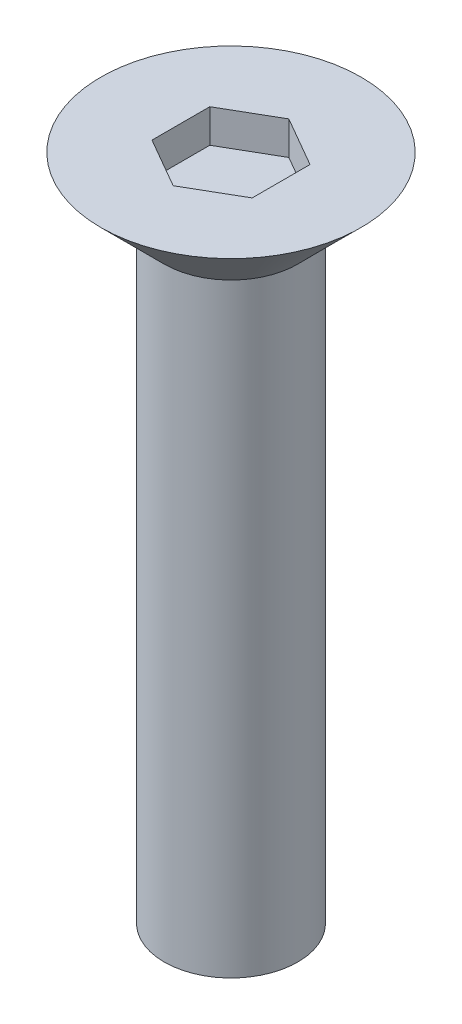
ISO-10303-21;
HEADER;
FILE_DESCRIPTION(('STEP AP214'),'2;1');
FILE_NAME('part.step','',(''),(''),'','','');
FILE_SCHEMA(('AUTOMOTIVE_DESIGN { 1 0 10303 214 1 1 1 1 }'));
ENDSEC;
DATA;
#1=APPLICATION_CONTEXT('core data for automotive mechanical design processes');
#2=APPLICATION_PROTOCOL_DEFINITION('international standard','automotive_design',2000,#1);
#3=PRODUCT_CONTEXT('',#1,'mechanical');
#4=PRODUCT('Part','Part','',(#3));
#5=PRODUCT_RELATED_PRODUCT_CATEGORY('part','',(#4));
#6=PRODUCT_DEFINITION_FORMATION('','',#4);
#7=PRODUCT_DEFINITION_CONTEXT('part definition',#1,'design');
#8=PRODUCT_DEFINITION('design','',#6,#7);
#9=PRODUCT_DEFINITION_SHAPE('','',#8);
#10=(LENGTH_UNIT() NAMED_UNIT(*) SI_UNIT(.MILLI.,.METRE.));
#11=(NAMED_UNIT(*) PLANE_ANGLE_UNIT() SI_UNIT($,.RADIAN.));
#12=(NAMED_UNIT(*) SI_UNIT($,.STERADIAN.) SOLID_ANGLE_UNIT());
#13=UNCERTAINTY_MEASURE_WITH_UNIT(LENGTH_MEASURE(1.E-05),#10,'distance_accuracy_value','');
#14=(GEOMETRIC_REPRESENTATION_CONTEXT(3) GLOBAL_UNCERTAINTY_ASSIGNED_CONTEXT((#13)) GLOBAL_UNIT_ASSIGNED_CONTEXT((#10,
#11,#12)) REPRESENTATION_CONTEXT('',''));
#15=CARTESIAN_POINT('',(0.,0.,0.));
#16=DIRECTION('',(0.,0.,1.));
#17=DIRECTION('',(1.,0.,0.));
#18=AXIS2_PLACEMENT_3D('',#15,#16,#17);
#19=CARTESIAN_POINT('',(0.,20.,0.));
#20=DIRECTION('',(0.,-1.,0.));
#21=DIRECTION('',(0.,0.,-1.));
#22=AXIS2_PLACEMENT_3D('',#19,#20,#21);
#23=CYLINDRICAL_SURFACE('',#22,2.);
#24=CARTESIAN_POINT('',(0.,0.,0.));
#25=DIRECTION('',(0.,1.,0.));
#26=DIRECTION('',(0.,0.,1.));
#27=AXIS2_PLACEMENT_3D('',#24,#25,#26);
#28=CIRCLE('',#27,2.);
#29=CARTESIAN_POINT('',(0.,0.,2.));
#30=VERTEX_POINT('',#29);
#31=EDGE_CURVE('E40',#30,#30,#28,.T.);
#32=ORIENTED_EDGE('',*,*,#31,.T.);
#33=EDGE_LOOP('',(#32));
#34=FACE_BOUND('',#33,.T.);
#35=CARTESIAN_POINT('',(0.,18.1,0.));
#36=DIRECTION('',(0.,1.,0.));
#37=DIRECTION('',(0.,0.,1.));
#38=AXIS2_PLACEMENT_3D('',#35,#36,#37);
#39=CIRCLE('',#38,2.);
#40=CARTESIAN_POINT('',(0.,18.1,2.));
#41=VERTEX_POINT('',#40);
#42=EDGE_CURVE('E11',#41,#41,#39,.T.);
#43=ORIENTED_EDGE('',*,*,#42,.F.);
#44=EDGE_LOOP('',(#43));
#45=FACE_BOUND('',#44,.T.);
#46=ADVANCED_FACE('F33',(#34,#45),#23,.T.);
#47=CARTESIAN_POINT('',(0.,0.,0.));
#48=DIRECTION('',(0.,1.,0.));
#49=DIRECTION('',(0.,0.,1.));
#50=AXIS2_PLACEMENT_3D('',#47,#48,#49);
#51=PLANE('',#50);
#52=ORIENTED_EDGE('',*,*,#31,.F.);
#53=EDGE_LOOP('',(#52));
#54=FACE_BOUND('',#53,.T.);
#55=ADVANCED_FACE('F146',(#54),#51,.F.);
#56=CARTESIAN_POINT('',(0.,20.,0.));
#57=DIRECTION('',(0.,1.,0.));
#58=DIRECTION('',(0.,0.,1.));
#59=AXIS2_PLACEMENT_3D('',#56,#57,#58);
#60=CONICAL_SURFACE('',#59,3.9,0.785398163397453);
#61=CARTESIAN_POINT('',(0.,20.,0.));
#62=DIRECTION('',(0.,-1.,0.));
#63=DIRECTION('',(0.,0.,-1.));
#64=AXIS2_PLACEMENT_3D('',#61,#62,#63);
#65=CIRCLE('',#64,3.9);
#66=CARTESIAN_POINT('',(0.,20.,-3.9));
#67=VERTEX_POINT('',#66);
#68=EDGE_CURVE('E134',#67,#67,#65,.T.);
#69=ORIENTED_EDGE('',*,*,#68,.T.);
#70=EDGE_LOOP('',(#69));
#71=FACE_BOUND('',#70,.T.);
#72=ORIENTED_EDGE('',*,*,#42,.T.);
#73=EDGE_LOOP('',(#72));
#74=FACE_BOUND('',#73,.T.);
#75=ADVANCED_FACE('F148',(#71,#74),#60,.T.);
#76=CARTESIAN_POINT('',(0.,20.,0.));
#77=DIRECTION('',(0.,1.,0.));
#78=DIRECTION('',(0.,0.,1.));
#79=AXIS2_PLACEMENT_3D('',#76,#77,#78);
#80=PLANE('',#79);
#81=DIRECTION('',(-0.866025403784439,0.,-0.5));
#82=VECTOR('',#81,1.);
#83=CARTESIAN_POINT('',(1.5,20.,-0.866025403784439));
#84=LINE('',#83,#82);
#85=CARTESIAN_POINT('',(1.5,20.,-0.866025403784439));
#86=VERTEX_POINT('',#85);
#87=CARTESIAN_POINT('',(0.,20.,-1.73205080756888));
#88=VERTEX_POINT('',#87);
#89=EDGE_CURVE('E47',#86,#88,#84,.T.);
#90=ORIENTED_EDGE('',*,*,#89,.F.);
#91=DIRECTION('',(0.,0.,-1.));
#92=VECTOR('',#91,1.);
#93=CARTESIAN_POINT('',(1.5,20.,0.866025403784439));
#94=LINE('',#93,#92);
#95=CARTESIAN_POINT('',(1.5,20.,0.866025403784439));
#96=VERTEX_POINT('',#95);
#97=EDGE_CURVE('E130',#96,#86,#94,.T.);
#98=ORIENTED_EDGE('',*,*,#97,.F.);
#99=DIRECTION('',(0.866025403784439,0.,-0.5));
#100=VECTOR('',#99,1.);
#101=CARTESIAN_POINT('',(0.,20.,1.73205080756888));
#102=LINE('',#101,#100);
#103=CARTESIAN_POINT('',(0.,20.,1.73205080756888));
#104=VERTEX_POINT('',#103);
#105=EDGE_CURVE('E128',#104,#96,#102,.T.);
#106=ORIENTED_EDGE('',*,*,#105,.F.);
#107=DIRECTION('',(0.866025403784438,0.,0.5));
#108=VECTOR('',#107,1.);
#109=CARTESIAN_POINT('',(-1.5,20.,0.866025403784439));
#110=LINE('',#109,#108);
#111=CARTESIAN_POINT('',(-1.5,20.,0.866025403784439));
#112=VERTEX_POINT('',#111);
#113=EDGE_CURVE('E95',#112,#104,#110,.T.);
#114=ORIENTED_EDGE('',*,*,#113,.F.);
#115=DIRECTION('',(0.,0.,1.));
#116=VECTOR('',#115,1.);
#117=CARTESIAN_POINT('',(-1.5,20.,-0.866025403784438));
#118=LINE('',#117,#116);
#119=CARTESIAN_POINT('',(-1.5,20.,-0.866025403784438));
#120=VERTEX_POINT('',#119);
#121=EDGE_CURVE('E124',#120,#112,#118,.T.);
#122=ORIENTED_EDGE('',*,*,#121,.F.);
#123=DIRECTION('',(-0.866025403784438,0.,0.5));
#124=VECTOR('',#123,1.);
#125=CARTESIAN_POINT('',(0.,20.,-1.73205080756888));
#126=LINE('',#125,#124);
#127=EDGE_CURVE('E121',#88,#120,#126,.T.);
#128=ORIENTED_EDGE('',*,*,#127,.F.);
#129=EDGE_LOOP('',(#90,#98,#106,#114,#122,#128));
#130=FACE_BOUND('',#129,.T.);
#131=ORIENTED_EDGE('',*,*,#68,.F.);
#132=EDGE_LOOP('',(#131));
#133=FACE_BOUND('',#132,.T.);
#134=ADVANCED_FACE('F153',(#130,#133),#80,.T.);
#135=CARTESIAN_POINT('',(1.5,19.,-0.866025403784439));
#136=DIRECTION('',(0.5,0.,-0.866025403784439));
#137=DIRECTION('',(-0.866025403784439,0.,-0.5));
#138=AXIS2_PLACEMENT_3D('',#135,#136,#137);
#139=PLANE('',#138);
#140=ORIENTED_EDGE('',*,*,#89,.T.);
#141=DIRECTION('',(0.,1.,0.));
#142=VECTOR('',#141,1.);
#143=CARTESIAN_POINT('',(0.,19.,-1.73205080756888));
#144=LINE('',#143,#142);
#145=CARTESIAN_POINT('',(0.,19.,-1.73205080756888));
#146=VERTEX_POINT('',#145);
#147=EDGE_CURVE('E77',#146,#88,#144,.T.);
#148=ORIENTED_EDGE('',*,*,#147,.F.);
#149=DIRECTION('',(-0.866025403784439,0.,-0.5));
#150=VECTOR('',#149,1.);
#151=CARTESIAN_POINT('',(1.5,19.,-0.866025403784439));
#152=LINE('',#151,#150);
#153=CARTESIAN_POINT('',(1.5,19.,-0.866025403784439));
#154=VERTEX_POINT('',#153);
#155=EDGE_CURVE('E132',#154,#146,#152,.T.);
#156=ORIENTED_EDGE('',*,*,#155,.F.);
#157=DIRECTION('',(0.,1.,0.));
#158=VECTOR('',#157,1.);
#159=CARTESIAN_POINT('',(1.5,19.,-0.866025403784439));
#160=LINE('',#159,#158);
#161=EDGE_CURVE('E55',#154,#86,#160,.T.);
#162=ORIENTED_EDGE('',*,*,#161,.T.);
#163=EDGE_LOOP('',(#140,#148,#156,#162));
#164=FACE_BOUND('',#163,.T.);
#165=ADVANCED_FACE('F158',(#164),#139,.F.);
#166=CARTESIAN_POINT('',(1.5,19.,0.866025403784439));
#167=DIRECTION('',(1.,0.,0.));
#168=DIRECTION('',(0.,0.,-1.));
#169=AXIS2_PLACEMENT_3D('',#166,#167,#168);
#170=PLANE('',#169);
#171=ORIENTED_EDGE('',*,*,#97,.T.);
#172=ORIENTED_EDGE('',*,*,#161,.F.);
#173=DIRECTION('',(0.,0.,-1.));
#174=VECTOR('',#173,1.);
#175=CARTESIAN_POINT('',(1.5,19.,0.866025403784439));
#176=LINE('',#175,#174);
#177=CARTESIAN_POINT('',(1.5,19.,0.866025403784439));
#178=VERTEX_POINT('',#177);
#179=EDGE_CURVE('E107',#178,#154,#176,.T.);
#180=ORIENTED_EDGE('',*,*,#179,.F.);
#181=DIRECTION('',(0.,1.,0.));
#182=VECTOR('',#181,1.);
#183=CARTESIAN_POINT('',(1.5,19.,0.866025403784439));
#184=LINE('',#183,#182);
#185=EDGE_CURVE('E99',#178,#96,#184,.T.);
#186=ORIENTED_EDGE('',*,*,#185,.T.);
#187=EDGE_LOOP('',(#171,#172,#180,#186));
#188=FACE_BOUND('',#187,.T.);
#189=ADVANCED_FACE('F163',(#188),#170,.F.);
#190=CARTESIAN_POINT('',(0.,19.,1.73205080756888));
#191=DIRECTION('',(0.5,0.,0.866025403784439));
#192=DIRECTION('',(0.866025403784439,0.,-0.5));
#193=AXIS2_PLACEMENT_3D('',#190,#191,#192);
#194=PLANE('',#193);
#195=ORIENTED_EDGE('',*,*,#105,.T.);
#196=ORIENTED_EDGE('',*,*,#185,.F.);
#197=DIRECTION('',(0.866025403784439,0.,-0.5));
#198=VECTOR('',#197,1.);
#199=CARTESIAN_POINT('',(0.,19.,1.73205080756888));
#200=LINE('',#199,#198);
#201=CARTESIAN_POINT('',(0.,19.,1.73205080756888));
#202=VERTEX_POINT('',#201);
#203=EDGE_CURVE('E103',#202,#178,#200,.T.);
#204=ORIENTED_EDGE('',*,*,#203,.F.);
#205=DIRECTION('',(0.,1.,0.));
#206=VECTOR('',#205,1.);
#207=CARTESIAN_POINT('',(0.,19.,1.73205080756888));
#208=LINE('',#207,#206);
#209=EDGE_CURVE('E88',#202,#104,#208,.T.);
#210=ORIENTED_EDGE('',*,*,#209,.T.);
#211=EDGE_LOOP('',(#195,#196,#204,#210));
#212=FACE_BOUND('',#211,.T.);
#213=ADVANCED_FACE('F104',(#212),#194,.F.);
#214=CARTESIAN_POINT('',(-1.5,19.,0.866025403784439));
#215=DIRECTION('',(-0.5,0.,0.866025403784439));
#216=DIRECTION('',(0.866025403784438,0.,0.5));
#217=AXIS2_PLACEMENT_3D('',#214,#215,#216);
#218=PLANE('',#217);
#219=ORIENTED_EDGE('',*,*,#113,.T.);
#220=ORIENTED_EDGE('',*,*,#209,.F.);
#221=DIRECTION('',(0.866025403784438,0.,0.5));
#222=VECTOR('',#221,1.);
#223=CARTESIAN_POINT('',(-1.5,19.,0.866025403784439));
#224=LINE('',#223,#222);
#225=CARTESIAN_POINT('',(-1.5,19.,0.866025403784439));
#226=VERTEX_POINT('',#225);
#227=EDGE_CURVE('E92',#226,#202,#224,.T.);
#228=ORIENTED_EDGE('',*,*,#227,.F.);
#229=DIRECTION('',(0.,1.,0.));
#230=VECTOR('',#229,1.);
#231=CARTESIAN_POINT('',(-1.5,19.,0.866025403784439));
#232=LINE('',#231,#230);
#233=EDGE_CURVE('E100',#226,#112,#232,.T.);
#234=ORIENTED_EDGE('',*,*,#233,.T.);
#235=EDGE_LOOP('',(#219,#220,#228,#234));
#236=FACE_BOUND('',#235,.T.);
#237=ADVANCED_FACE('F90',(#236),#218,.F.);
#238=CARTESIAN_POINT('',(-1.5,19.,-0.866025403784438));
#239=DIRECTION('',(-1.,0.,0.));
#240=DIRECTION('',(0.,0.,1.));
#241=AXIS2_PLACEMENT_3D('',#238,#239,#240);
#242=PLANE('',#241);
#243=ORIENTED_EDGE('',*,*,#121,.T.);
#244=ORIENTED_EDGE('',*,*,#233,.F.);
#245=DIRECTION('',(0.,0.,1.));
#246=VECTOR('',#245,1.);
#247=CARTESIAN_POINT('',(-1.5,19.,-0.866025403784438));
#248=LINE('',#247,#246);
#249=CARTESIAN_POINT('',(-1.5,19.,-0.866025403784438));
#250=VERTEX_POINT('',#249);
#251=EDGE_CURVE('E113',#250,#226,#248,.T.);
#252=ORIENTED_EDGE('',*,*,#251,.F.);
#253=DIRECTION('',(0.,1.,0.));
#254=VECTOR('',#253,1.);
#255=CARTESIAN_POINT('',(-1.5,19.,-0.866025403784438));
#256=LINE('',#255,#254);
#257=EDGE_CURVE('E137',#250,#120,#256,.T.);
#258=ORIENTED_EDGE('',*,*,#257,.T.);
#259=EDGE_LOOP('',(#243,#244,#252,#258));
#260=FACE_BOUND('',#259,.T.);
#261=ADVANCED_FACE('F167',(#260),#242,.F.);
#262=CARTESIAN_POINT('',(0.,19.,-1.73205080756888));
#263=DIRECTION('',(-0.5,0.,-0.866025403784439));
#264=DIRECTION('',(-0.866025403784438,0.,0.5));
#265=AXIS2_PLACEMENT_3D('',#262,#263,#264);
#266=PLANE('',#265);
#267=ORIENTED_EDGE('',*,*,#127,.T.);
#268=ORIENTED_EDGE('',*,*,#257,.F.);
#269=DIRECTION('',(-0.866025403784438,0.,0.5));
#270=VECTOR('',#269,1.);
#271=CARTESIAN_POINT('',(0.,19.,-1.73205080756888));
#272=LINE('',#271,#270);
#273=EDGE_CURVE('E115',#146,#250,#272,.T.);
#274=ORIENTED_EDGE('',*,*,#273,.F.);
#275=ORIENTED_EDGE('',*,*,#147,.T.);
#276=EDGE_LOOP('',(#267,#268,#274,#275));
#277=FACE_BOUND('',#276,.T.);
#278=ADVANCED_FACE('F164',(#277),#266,.F.);
#279=CARTESIAN_POINT('',(0.,19.,0.));
#280=DIRECTION('',(0.,1.,0.));
#281=DIRECTION('',(0.,0.,1.));
#282=AXIS2_PLACEMENT_3D('',#279,#280,#281);
#283=PLANE('',#282);
#284=ORIENTED_EDGE('',*,*,#155,.T.);
#285=ORIENTED_EDGE('',*,*,#273,.T.);
#286=ORIENTED_EDGE('',*,*,#251,.T.);
#287=ORIENTED_EDGE('',*,*,#227,.T.);
#288=ORIENTED_EDGE('',*,*,#203,.T.);
#289=ORIENTED_EDGE('',*,*,#179,.T.);
#290=EDGE_LOOP('',(#284,#285,#286,#287,#288,#289));
#291=FACE_BOUND('',#290,.T.);
#292=ADVANCED_FACE('F110',(#291),#283,.T.);
#293=CLOSED_SHELL('',(#46,#55,#75,#134,#165,#189,#213,#237,#261,#278,#292));
#294=MANIFOLD_SOLID_BREP('B2',#293);
#295=ADVANCED_BREP_SHAPE_REPRESENTATION('',(#18,#294),#14);
#296=SHAPE_DEFINITION_REPRESENTATION(#9,#295);
ENDSEC;
END-ISO-10303-21;
